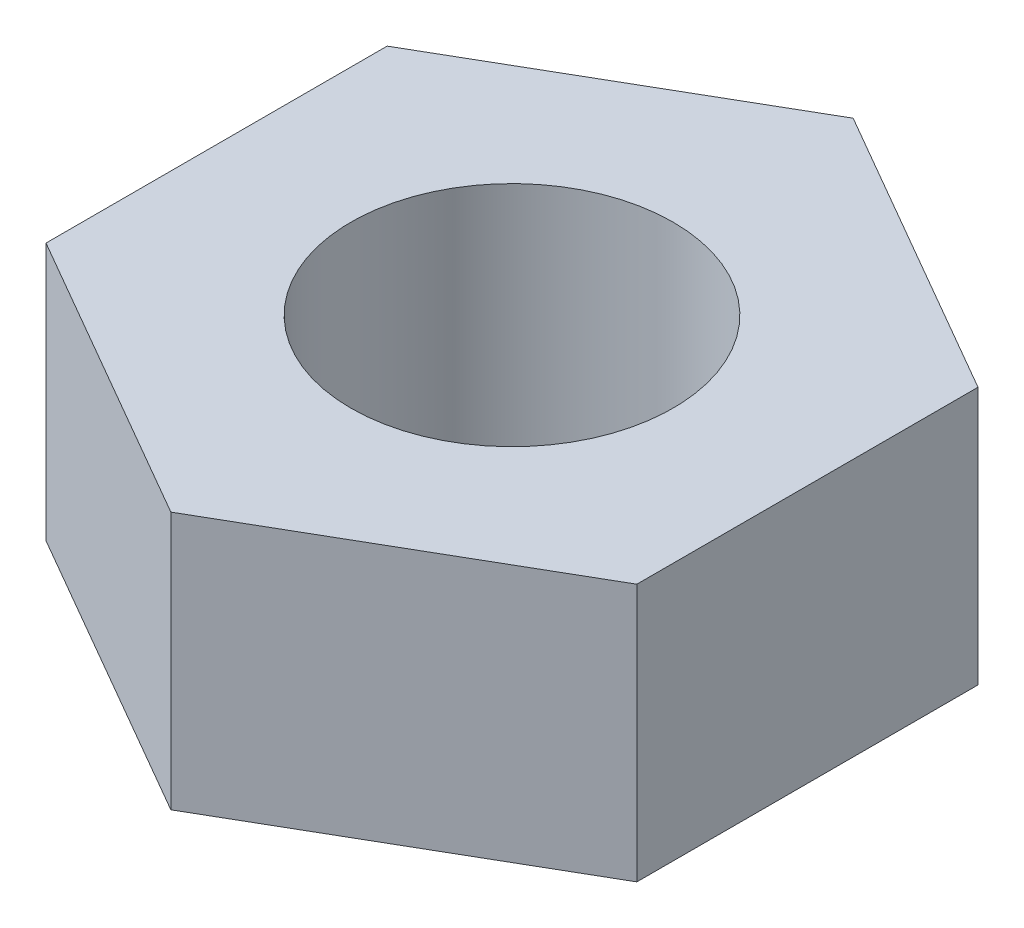
ISO-10303-21;
HEADER;
FILE_DESCRIPTION(('STEP AP214'),'2;1');
FILE_NAME('part.step','',(''),(''),'','','');
FILE_SCHEMA(('AUTOMOTIVE_DESIGN { 1 0 10303 214 1 1 1 1 }'));
ENDSEC;
DATA;
#1=APPLICATION_CONTEXT('core data for automotive mechanical design processes');
#2=APPLICATION_PROTOCOL_DEFINITION('international standard','automotive_design',2000,#1);
#3=PRODUCT_CONTEXT('',#1,'mechanical');
#4=PRODUCT('Part','Part','',(#3));
#5=PRODUCT_RELATED_PRODUCT_CATEGORY('part','',(#4));
#6=PRODUCT_DEFINITION_FORMATION('','',#4);
#7=PRODUCT_DEFINITION_CONTEXT('part definition',#1,'design');
#8=PRODUCT_DEFINITION('design','',#6,#7);
#9=PRODUCT_DEFINITION_SHAPE('','',#8);
#10=(LENGTH_UNIT() NAMED_UNIT(*) SI_UNIT(.MILLI.,.METRE.));
#11=(NAMED_UNIT(*) PLANE_ANGLE_UNIT() SI_UNIT($,.RADIAN.));
#12=(NAMED_UNIT(*) SI_UNIT($,.STERADIAN.) SOLID_ANGLE_UNIT());
#13=UNCERTAINTY_MEASURE_WITH_UNIT(LENGTH_MEASURE(1.E-05),#10,'distance_accuracy_value','');
#14=(GEOMETRIC_REPRESENTATION_CONTEXT(3) GLOBAL_UNCERTAINTY_ASSIGNED_CONTEXT((#13)) GLOBAL_UNIT_ASSIGNED_CONTEXT((#10,
#11,#12)) REPRESENTATION_CONTEXT('',''));
#15=CARTESIAN_POINT('',(0.,0.,0.));
#16=DIRECTION('',(0.,0.,1.));
#17=DIRECTION('',(1.,0.,0.));
#18=AXIS2_PLACEMENT_3D('',#15,#16,#17);
#19=CARTESIAN_POINT('',(0.,2.4,0.));
#20=DIRECTION('',(0.,1.,0.));
#21=DIRECTION('',(0.,0.,1.));
#22=AXIS2_PLACEMENT_3D('',#19,#20,#21);
#23=PLANE('',#22);
#24=DIRECTION('',(-0.866025403784439,0.,-0.5));
#25=VECTOR('',#24,1.);
#26=CARTESIAN_POINT('',(2.75,2.4,-1.58771324027148));
#27=LINE('',#26,#25);
#28=CARTESIAN_POINT('',(2.75,2.4,-1.58771324027148));
#29=VERTEX_POINT('',#28);
#30=CARTESIAN_POINT('',(0.,2.4,-3.17542648054294));
#31=VERTEX_POINT('',#30);
#32=EDGE_CURVE('E133',#29,#31,#27,.T.);
#33=ORIENTED_EDGE('',*,*,#32,.T.);
#34=DIRECTION('',(-0.866025403784439,0.,0.5));
#35=VECTOR('',#34,1.);
#36=CARTESIAN_POINT('',(0.,2.4,-3.17542648054294));
#37=LINE('',#36,#35);
#38=CARTESIAN_POINT('',(-2.75,2.4,-1.58771324027147));
#39=VERTEX_POINT('',#38);
#40=EDGE_CURVE('E91',#31,#39,#37,.T.);
#41=ORIENTED_EDGE('',*,*,#40,.T.);
#42=DIRECTION('',(0.,0.,1.));
#43=VECTOR('',#42,1.);
#44=CARTESIAN_POINT('',(-2.75,2.4,-1.58771324027147));
#45=LINE('',#44,#43);
#46=CARTESIAN_POINT('',(-2.75,2.4,1.58771324027147));
#47=VERTEX_POINT('',#46);
#48=EDGE_CURVE('E104',#39,#47,#45,.T.);
#49=ORIENTED_EDGE('',*,*,#48,.T.);
#50=DIRECTION('',(0.866025403784438,0.,0.500000000000001));
#51=VECTOR('',#50,1.);
#52=CARTESIAN_POINT('',(-2.75,2.4,1.58771324027147));
#53=LINE('',#52,#51);
#54=CARTESIAN_POINT('',(0.,2.4,3.17542648054294));
#55=VERTEX_POINT('',#54);
#56=EDGE_CURVE('E98',#47,#55,#53,.T.);
#57=ORIENTED_EDGE('',*,*,#56,.T.);
#58=DIRECTION('',(0.866025403784439,0.,-0.5));
#59=VECTOR('',#58,1.);
#60=CARTESIAN_POINT('',(0.,2.4,3.17542648054294));
#61=LINE('',#60,#59);
#62=CARTESIAN_POINT('',(2.75,2.4,1.58771324027147));
#63=VERTEX_POINT('',#62);
#64=EDGE_CURVE('E102',#55,#63,#61,.T.);
#65=ORIENTED_EDGE('',*,*,#64,.T.);
#66=DIRECTION('',(0.,0.,-1.));
#67=VECTOR('',#66,1.);
#68=CARTESIAN_POINT('',(2.75,2.4,1.58771324027147));
#69=LINE('',#68,#67);
#70=EDGE_CURVE('E54',#63,#29,#69,.T.);
#71=ORIENTED_EDGE('',*,*,#70,.T.);
#72=EDGE_LOOP('',(#33,#41,#49,#57,#65,#71));
#73=FACE_BOUND('',#72,.T.);
#74=CARTESIAN_POINT('',(0.,2.4,0.));
#75=DIRECTION('',(0.,1.,0.));
#76=DIRECTION('',(0.,0.,1.));
#77=AXIS2_PLACEMENT_3D('',#74,#75,#76);
#78=CIRCLE('',#77,1.5);
#79=CARTESIAN_POINT('',(0.,2.4,1.5));
#80=VERTEX_POINT('',#79);
#81=EDGE_CURVE('E126',#80,#80,#78,.T.);
#82=ORIENTED_EDGE('',*,*,#81,.F.);
#83=EDGE_LOOP('',(#82));
#84=FACE_BOUND('',#83,.T.);
#85=ADVANCED_FACE('F37',(#73,#84),#23,.T.);
#86=CARTESIAN_POINT('',(0.,0.,0.));
#87=DIRECTION('',(0.,1.,0.));
#88=DIRECTION('',(0.,0.,1.));
#89=AXIS2_PLACEMENT_3D('',#86,#87,#88);
#90=PLANE('',#89);
#91=DIRECTION('',(-0.866025403784439,0.,-0.5));
#92=VECTOR('',#91,1.);
#93=CARTESIAN_POINT('',(2.75,0.,-1.58771324027148));
#94=LINE('',#93,#92);
#95=CARTESIAN_POINT('',(2.75,0.,-1.58771324027148));
#96=VERTEX_POINT('',#95);
#97=CARTESIAN_POINT('',(0.,0.,-3.17542648054294));
#98=VERTEX_POINT('',#97);
#99=EDGE_CURVE('E122',#96,#98,#94,.T.);
#100=ORIENTED_EDGE('',*,*,#99,.F.);
#101=DIRECTION('',(0.,0.,-1.));
#102=VECTOR('',#101,1.);
#103=CARTESIAN_POINT('',(2.75,0.,1.58771324027147));
#104=LINE('',#103,#102);
#105=CARTESIAN_POINT('',(2.75,0.,1.58771324027147));
#106=VERTEX_POINT('',#105);
#107=EDGE_CURVE('E83',#106,#96,#104,.T.);
#108=ORIENTED_EDGE('',*,*,#107,.F.);
#109=DIRECTION('',(0.866025403784439,0.,-0.5));
#110=VECTOR('',#109,1.);
#111=CARTESIAN_POINT('',(0.,0.,3.17542648054294));
#112=LINE('',#111,#110);
#113=CARTESIAN_POINT('',(0.,0.,3.17542648054294));
#114=VERTEX_POINT('',#113);
#115=EDGE_CURVE('E77',#114,#106,#112,.T.);
#116=ORIENTED_EDGE('',*,*,#115,.F.);
#117=DIRECTION('',(0.866025403784438,0.,0.500000000000001));
#118=VECTOR('',#117,1.);
#119=CARTESIAN_POINT('',(-2.75,0.,1.58771324027147));
#120=LINE('',#119,#118);
#121=CARTESIAN_POINT('',(-2.75,0.,1.58771324027147));
#122=VERTEX_POINT('',#121);
#123=EDGE_CURVE('E112',#122,#114,#120,.T.);
#124=ORIENTED_EDGE('',*,*,#123,.F.);
#125=DIRECTION('',(0.,0.,1.));
#126=VECTOR('',#125,1.);
#127=CARTESIAN_POINT('',(-2.75,0.,-1.58771324027147));
#128=LINE('',#127,#126);
#129=CARTESIAN_POINT('',(-2.75,0.,-1.58771324027147));
#130=VERTEX_POINT('',#129);
#131=EDGE_CURVE('E128',#130,#122,#128,.T.);
#132=ORIENTED_EDGE('',*,*,#131,.F.);
#133=DIRECTION('',(-0.866025403784439,0.,0.5));
#134=VECTOR('',#133,1.);
#135=CARTESIAN_POINT('',(0.,0.,-3.17542648054294));
#136=LINE('',#135,#134);
#137=EDGE_CURVE('E125',#98,#130,#136,.T.);
#138=ORIENTED_EDGE('',*,*,#137,.F.);
#139=EDGE_LOOP('',(#100,#108,#116,#124,#132,#138));
#140=FACE_BOUND('',#139,.T.);
#141=CARTESIAN_POINT('',(0.,0.,0.));
#142=DIRECTION('',(0.,1.,0.));
#143=DIRECTION('',(0.,0.,1.));
#144=AXIS2_PLACEMENT_3D('',#141,#142,#143);
#145=CIRCLE('',#144,1.5);
#146=CARTESIAN_POINT('',(0.,0.,1.5));
#147=VERTEX_POINT('',#146);
#148=EDGE_CURVE('E226',#147,#147,#145,.T.);
#149=ORIENTED_EDGE('',*,*,#148,.T.);
#150=EDGE_LOOP('',(#149));
#151=FACE_BOUND('',#150,.T.);
#152=ADVANCED_FACE('F142',(#140,#151),#90,.F.);
#153=CARTESIAN_POINT('',(2.75,2.4,-1.58771324027148));
#154=DIRECTION('',(-0.5,0.,0.866025403784439));
#155=DIRECTION('',(0.866025403784439,0.,0.5));
#156=AXIS2_PLACEMENT_3D('',#153,#154,#155);
#157=PLANE('',#156);
#158=ORIENTED_EDGE('',*,*,#99,.T.);
#159=DIRECTION('',(0.,-1.,0.));
#160=VECTOR('',#159,1.);
#161=CARTESIAN_POINT('',(0.,2.4,-3.17542648054294));
#162=LINE('',#161,#160);
#163=EDGE_CURVE('E11',#31,#98,#162,.T.);
#164=ORIENTED_EDGE('',*,*,#163,.F.);
#165=ORIENTED_EDGE('',*,*,#32,.F.);
#166=DIRECTION('',(0.,-1.,0.));
#167=VECTOR('',#166,1.);
#168=CARTESIAN_POINT('',(2.75,2.4,-1.58771324027148));
#169=LINE('',#168,#167);
#170=EDGE_CURVE('E118',#29,#96,#169,.T.);
#171=ORIENTED_EDGE('',*,*,#170,.T.);
#172=EDGE_LOOP('',(#158,#164,#165,#171));
#173=FACE_BOUND('',#172,.T.);
#174=ADVANCED_FACE('F39',(#173),#157,.F.);
#175=CARTESIAN_POINT('',(0.,2.4,-3.17542648054294));
#176=DIRECTION('',(0.5,0.,0.866025403784439));
#177=DIRECTION('',(0.866025403784439,0.,-0.5));
#178=AXIS2_PLACEMENT_3D('',#175,#176,#177);
#179=PLANE('',#178);
#180=ORIENTED_EDGE('',*,*,#137,.T.);
#181=DIRECTION('',(0.,-1.,0.));
#182=VECTOR('',#181,1.);
#183=CARTESIAN_POINT('',(-2.75,2.4,-1.58771324027147));
#184=LINE('',#183,#182);
#185=EDGE_CURVE('E46',#39,#130,#184,.T.);
#186=ORIENTED_EDGE('',*,*,#185,.F.);
#187=ORIENTED_EDGE('',*,*,#40,.F.);
#188=ORIENTED_EDGE('',*,*,#163,.T.);
#189=EDGE_LOOP('',(#180,#186,#187,#188));
#190=FACE_BOUND('',#189,.T.);
#191=ADVANCED_FACE('F167',(#190),#179,.F.);
#192=CARTESIAN_POINT('',(-2.75,2.4,-1.58771324027147));
#193=DIRECTION('',(1.,0.,0.));
#194=DIRECTION('',(0.,0.,-1.));
#195=AXIS2_PLACEMENT_3D('',#192,#193,#194);
#196=PLANE('',#195);
#197=ORIENTED_EDGE('',*,*,#131,.T.);
#198=DIRECTION('',(0.,-1.,0.));
#199=VECTOR('',#198,1.);
#200=CARTESIAN_POINT('',(-2.75,2.4,1.58771324027147));
#201=LINE('',#200,#199);
#202=EDGE_CURVE('E113',#47,#122,#201,.T.);
#203=ORIENTED_EDGE('',*,*,#202,.F.);
#204=ORIENTED_EDGE('',*,*,#48,.F.);
#205=ORIENTED_EDGE('',*,*,#185,.T.);
#206=EDGE_LOOP('',(#197,#203,#204,#205));
#207=FACE_BOUND('',#206,.T.);
#208=ADVANCED_FACE('F139',(#207),#196,.F.);
#209=CARTESIAN_POINT('',(-2.75,2.4,1.58771324027147));
#210=DIRECTION('',(0.500000000000001,0.,-0.866025403784438));
#211=DIRECTION('',(-0.866025403784438,0.,-0.500000000000001));
#212=AXIS2_PLACEMENT_3D('',#209,#210,#211);
#213=PLANE('',#212);
#214=ORIENTED_EDGE('',*,*,#123,.T.);
#215=DIRECTION('',(0.,-1.,0.));
#216=VECTOR('',#215,1.);
#217=CARTESIAN_POINT('',(0.,2.4,3.17542648054294));
#218=LINE('',#217,#216);
#219=EDGE_CURVE('E109',#55,#114,#218,.T.);
#220=ORIENTED_EDGE('',*,*,#219,.F.);
#221=ORIENTED_EDGE('',*,*,#56,.F.);
#222=ORIENTED_EDGE('',*,*,#202,.T.);
#223=EDGE_LOOP('',(#214,#220,#221,#222));
#224=FACE_BOUND('',#223,.T.);
#225=ADVANCED_FACE('F110',(#224),#213,.F.);
#226=CARTESIAN_POINT('',(0.,2.4,3.17542648054294));
#227=DIRECTION('',(-0.5,0.,-0.866025403784439));
#228=DIRECTION('',(-0.866025403784439,0.,0.5));
#229=AXIS2_PLACEMENT_3D('',#226,#227,#228);
#230=PLANE('',#229);
#231=ORIENTED_EDGE('',*,*,#115,.T.);
#232=DIRECTION('',(0.,-1.,0.));
#233=VECTOR('',#232,1.);
#234=CARTESIAN_POINT('',(2.75,2.4,1.58771324027147));
#235=LINE('',#234,#233);
#236=EDGE_CURVE('E114',#63,#106,#235,.T.);
#237=ORIENTED_EDGE('',*,*,#236,.F.);
#238=ORIENTED_EDGE('',*,*,#64,.F.);
#239=ORIENTED_EDGE('',*,*,#219,.T.);
#240=EDGE_LOOP('',(#231,#237,#238,#239));
#241=FACE_BOUND('',#240,.T.);
#242=ADVANCED_FACE('F116',(#241),#230,.F.);
#243=CARTESIAN_POINT('',(2.75,2.4,1.58771324027147));
#244=DIRECTION('',(-1.,0.,0.));
#245=DIRECTION('',(0.,0.,1.));
#246=AXIS2_PLACEMENT_3D('',#243,#244,#245);
#247=PLANE('',#246);
#248=ORIENTED_EDGE('',*,*,#107,.T.);
#249=ORIENTED_EDGE('',*,*,#170,.F.);
#250=ORIENTED_EDGE('',*,*,#70,.F.);
#251=ORIENTED_EDGE('',*,*,#236,.T.);
#252=EDGE_LOOP('',(#248,#249,#250,#251));
#253=FACE_BOUND('',#252,.T.);
#254=ADVANCED_FACE('F147',(#253),#247,.F.);
#255=CARTESIAN_POINT('',(0.,2.4,0.));
#256=DIRECTION('',(0.,-1.,0.));
#257=DIRECTION('',(0.,0.,-1.));
#258=AXIS2_PLACEMENT_3D('',#255,#256,#257);
#259=CYLINDRICAL_SURFACE('',#258,1.5);
#260=ORIENTED_EDGE('',*,*,#81,.T.);
#261=EDGE_LOOP('',(#260));
#262=FACE_BOUND('',#261,.T.);
#263=ORIENTED_EDGE('',*,*,#148,.F.);
#264=EDGE_LOOP('',(#263));
#265=FACE_BOUND('',#264,.T.);
#266=ADVANCED_FACE('F149',(#262,#265),#259,.F.);
#267=CLOSED_SHELL('',(#85,#152,#174,#191,#208,#225,#242,#254,#266));
#268=MANIFOLD_SOLID_BREP('B2',#267);
#269=ADVANCED_BREP_SHAPE_REPRESENTATION('',(#18,#268),#14);
#270=SHAPE_DEFINITION_REPRESENTATION(#9,#269);
ENDSEC;
END-ISO-10303-21;
